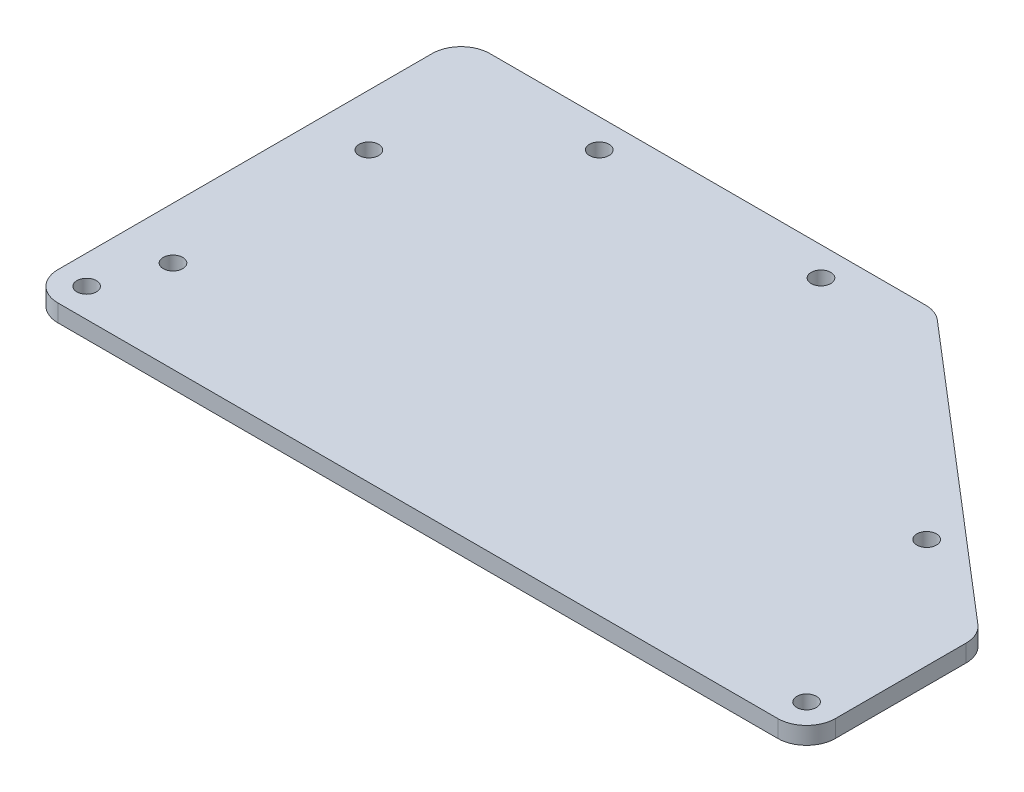
ISO-10303-21;
HEADER;
FILE_DESCRIPTION(('STEP AP214'),'2;1');
FILE_NAME('part.step','',(''),(''),'','','');
FILE_SCHEMA(('AUTOMOTIVE_DESIGN { 1 0 10303 214 1 1 1 1 }'));
ENDSEC;
DATA;
#1=APPLICATION_CONTEXT('core data for automotive mechanical design processes');
#2=APPLICATION_PROTOCOL_DEFINITION('international standard','automotive_design',2000,#1);
#3=PRODUCT_CONTEXT('',#1,'mechanical');
#4=PRODUCT('Part','Part','',(#3));
#5=PRODUCT_RELATED_PRODUCT_CATEGORY('part','',(#4));
#6=PRODUCT_DEFINITION_FORMATION('','',#4);
#7=PRODUCT_DEFINITION_CONTEXT('part definition',#1,'design');
#8=PRODUCT_DEFINITION('design','',#6,#7);
#9=PRODUCT_DEFINITION_SHAPE('','',#8);
#10=(LENGTH_UNIT() NAMED_UNIT(*) SI_UNIT(.MILLI.,.METRE.));
#11=(NAMED_UNIT(*) PLANE_ANGLE_UNIT() SI_UNIT($,.RADIAN.));
#12=(NAMED_UNIT(*) SI_UNIT($,.STERADIAN.) SOLID_ANGLE_UNIT());
#13=UNCERTAINTY_MEASURE_WITH_UNIT(LENGTH_MEASURE(1.E-05),#10,'distance_accuracy_value','');
#14=(GEOMETRIC_REPRESENTATION_CONTEXT(3) GLOBAL_UNCERTAINTY_ASSIGNED_CONTEXT((#13)) GLOBAL_UNIT_ASSIGNED_CONTEXT((#10,
#11,#12)) REPRESENTATION_CONTEXT('',''));
#15=CARTESIAN_POINT('',(0.,0.,0.));
#16=DIRECTION('',(0.,0.,1.));
#17=DIRECTION('',(1.,0.,0.));
#18=AXIS2_PLACEMENT_3D('',#15,#16,#17);
#19=CARTESIAN_POINT('',(67.5,3.,0.));
#20=DIRECTION('',(-1.,0.,0.));
#21=DIRECTION('',(0.,0.,1.));
#22=AXIS2_PLACEMENT_3D('',#19,#20,#21);
#23=PLANE('',#22);
#24=DIRECTION('',(0.,0.,-1.));
#25=VECTOR('',#24,1.);
#26=CARTESIAN_POINT('',(67.5,0.,0.));
#27=LINE('',#26,#25);
#28=CARTESIAN_POINT('',(67.5,0.,-5.));
#29=VERTEX_POINT('',#28);
#30=CARTESIAN_POINT('',(67.5,0.,-27.7003253876479));
#31=VERTEX_POINT('',#30);
#32=EDGE_CURVE('E211',#29,#31,#27,.T.);
#33=ORIENTED_EDGE('',*,*,#32,.T.);
#34=DIRECTION('',(0.,-1.,0.));
#35=VECTOR('',#34,1.);
#36=CARTESIAN_POINT('',(67.5,3.,-27.7003253876479));
#37=LINE('',#36,#35);
#38=CARTESIAN_POINT('',(67.5,3.,-27.7003253876479));
#39=VERTEX_POINT('',#38);
#40=EDGE_CURVE('E11',#31,#39,#37,.F.);
#41=ORIENTED_EDGE('',*,*,#40,.T.);
#42=DIRECTION('',(0.,0.,-1.));
#43=VECTOR('',#42,1.);
#44=CARTESIAN_POINT('',(67.5,3.,0.));
#45=LINE('',#44,#43);
#46=CARTESIAN_POINT('',(67.5,3.,-5.));
#47=VERTEX_POINT('',#46);
#48=EDGE_CURVE('E153',#47,#39,#45,.T.);
#49=ORIENTED_EDGE('',*,*,#48,.F.);
#50=DIRECTION('',(0.,-1.,0.));
#51=VECTOR('',#50,1.);
#52=CARTESIAN_POINT('',(67.5,3.,-5.));
#53=LINE('',#52,#51);
#54=EDGE_CURVE('E49',#47,#29,#53,.T.);
#55=ORIENTED_EDGE('',*,*,#54,.T.);
#56=EDGE_LOOP('',(#33,#41,#49,#55));
#57=FACE_BOUND('',#56,.T.);
#58=ADVANCED_FACE('F39',(#57),#23,.F.);
#59=CARTESIAN_POINT('',(67.5,3.,-30.));
#60=DIRECTION('',(-0.650791373455968,0.,0.759256602365297));
#61=DIRECTION('',(0.759256602365297,0.,0.650791373455968));
#62=AXIS2_PLACEMENT_3D('',#59,#60,#61);
#63=PLANE('',#62);
#64=DIRECTION('',(-0.759256602365297,0.,-0.650791373455968));
#65=VECTOR('',#64,1.);
#66=CARTESIAN_POINT('',(67.5,0.,-30.));
#67=LINE('',#66,#65);
#68=CARTESIAN_POINT('',(65.7539568672799,0.,-31.4966083994744));
#69=VERTEX_POINT('',#68);
#70=CARTESIAN_POINT('',(16.4043364862024,0.,-73.7962830118264));
#71=VERTEX_POINT('',#70);
#72=EDGE_CURVE('E155',#69,#71,#67,.T.);
#73=ORIENTED_EDGE('',*,*,#72,.T.);
#74=DIRECTION('',(0.,-1.,0.));
#75=VECTOR('',#74,1.);
#76=CARTESIAN_POINT('',(16.4043364862024,3.,-73.7962830118265));
#77=LINE('',#76,#75);
#78=CARTESIAN_POINT('',(16.4043364862024,3.,-73.7962830118264));
#79=VERTEX_POINT('',#78);
#80=EDGE_CURVE('E201',#71,#79,#77,.F.);
#81=ORIENTED_EDGE('',*,*,#80,.T.);
#82=DIRECTION('',(-0.759256602365297,0.,-0.650791373455968));
#83=VECTOR('',#82,1.);
#84=CARTESIAN_POINT('',(67.5,3.,-30.));
#85=LINE('',#84,#83);
#86=CARTESIAN_POINT('',(65.7539568672799,3.,-31.4966083994744));
#87=VERTEX_POINT('',#86);
#88=EDGE_CURVE('E266',#87,#79,#85,.T.);
#89=ORIENTED_EDGE('',*,*,#88,.F.);
#90=DIRECTION('',(0.,-1.,0.));
#91=VECTOR('',#90,1.);
#92=CARTESIAN_POINT('',(65.7539568672799,3.,-31.4966083994744));
#93=LINE('',#92,#91);
#94=EDGE_CURVE('E197',#87,#69,#93,.T.);
#95=ORIENTED_EDGE('',*,*,#94,.T.);
#96=EDGE_LOOP('',(#73,#81,#89,#95));
#97=FACE_BOUND('',#96,.T.);
#98=ADVANCED_FACE('F285',(#97),#63,.F.);
#99=CARTESIAN_POINT('',(-67.5,3.,-75.));
#100=DIRECTION('',(0.,0.,1.));
#101=DIRECTION('',(1.,0.,0.));
#102=AXIS2_PLACEMENT_3D('',#99,#100,#101);
#103=PLANE('',#102);
#104=DIRECTION('',(-1.,0.,0.));
#105=VECTOR('',#104,1.);
#106=CARTESIAN_POINT('',(-67.5,0.,-75.));
#107=LINE('',#106,#105);
#108=CARTESIAN_POINT('',(13.1503796189226,0.,-75.));
#109=VERTEX_POINT('',#108);
#110=CARTESIAN_POINT('',(-62.5,0.,-75.));
#111=VERTEX_POINT('',#110);
#112=EDGE_CURVE('E149',#109,#111,#107,.T.);
#113=ORIENTED_EDGE('',*,*,#112,.T.);
#114=DIRECTION('',(0.,-1.,0.));
#115=VECTOR('',#114,1.);
#116=CARTESIAN_POINT('',(-62.5,3.,-75.));
#117=LINE('',#116,#115);
#118=CARTESIAN_POINT('',(-62.5,3.,-75.));
#119=VERTEX_POINT('',#118);
#120=EDGE_CURVE('E125',#111,#119,#117,.F.);
#121=ORIENTED_EDGE('',*,*,#120,.T.);
#122=DIRECTION('',(-1.,0.,0.));
#123=VECTOR('',#122,1.);
#124=CARTESIAN_POINT('',(15.,3.,-75.));
#125=LINE('',#124,#123);
#126=CARTESIAN_POINT('',(13.1503796189226,3.,-75.));
#127=VERTEX_POINT('',#126);
#128=EDGE_CURVE('E270',#127,#119,#125,.T.);
#129=ORIENTED_EDGE('',*,*,#128,.F.);
#130=DIRECTION('',(0.,-1.,0.));
#131=VECTOR('',#130,1.);
#132=CARTESIAN_POINT('',(13.1503796189226,3.,-75.));
#133=LINE('',#132,#131);
#134=EDGE_CURVE('E131',#127,#109,#133,.T.);
#135=ORIENTED_EDGE('',*,*,#134,.T.);
#136=EDGE_LOOP('',(#113,#121,#129,#135));
#137=FACE_BOUND('',#136,.T.);
#138=ADVANCED_FACE('F295',(#137),#103,.F.);
#139=CARTESIAN_POINT('',(-67.5,3.,0.));
#140=DIRECTION('',(1.,0.,0.));
#141=DIRECTION('',(0.,0.,-1.));
#142=AXIS2_PLACEMENT_3D('',#139,#140,#141);
#143=PLANE('',#142);
#144=DIRECTION('',(0.,0.,1.));
#145=VECTOR('',#144,1.);
#146=CARTESIAN_POINT('',(-67.5,3.,-30.));
#147=LINE('',#146,#145);
#148=CARTESIAN_POINT('',(-67.5,3.,-70.));
#149=VERTEX_POINT('',#148);
#150=CARTESIAN_POINT('',(-67.5,3.,-5.00000000000001));
#151=VERTEX_POINT('',#150);
#152=EDGE_CURVE('E140',#149,#151,#147,.T.);
#153=ORIENTED_EDGE('',*,*,#152,.F.);
#154=DIRECTION('',(0.,-1.,0.));
#155=VECTOR('',#154,1.);
#156=CARTESIAN_POINT('',(-67.5,3.,-70.));
#157=LINE('',#156,#155);
#158=CARTESIAN_POINT('',(-67.5,0.,-70.));
#159=VERTEX_POINT('',#158);
#160=EDGE_CURVE('E124',#149,#159,#157,.T.);
#161=ORIENTED_EDGE('',*,*,#160,.T.);
#162=DIRECTION('',(0.,0.,1.));
#163=VECTOR('',#162,1.);
#164=CARTESIAN_POINT('',(-67.5,0.,0.));
#165=LINE('',#164,#163);
#166=CARTESIAN_POINT('',(-67.5,0.,-5.));
#167=VERTEX_POINT('',#166);
#168=EDGE_CURVE('E138',#159,#167,#165,.T.);
#169=ORIENTED_EDGE('',*,*,#168,.T.);
#170=DIRECTION('',(0.,-1.,0.));
#171=VECTOR('',#170,1.);
#172=CARTESIAN_POINT('',(-67.5,3.,-5.));
#173=LINE('',#172,#171);
#174=EDGE_CURVE('E143',#167,#151,#173,.F.);
#175=ORIENTED_EDGE('',*,*,#174,.T.);
#176=EDGE_LOOP('',(#153,#161,#169,#175));
#177=FACE_BOUND('',#176,.T.);
#178=ADVANCED_FACE('F137',(#177),#143,.F.);
#179=CARTESIAN_POINT('',(-67.5,3.,0.));
#180=DIRECTION('',(0.,0.,-1.));
#181=DIRECTION('',(-1.,0.,0.));
#182=AXIS2_PLACEMENT_3D('',#179,#180,#181);
#183=PLANE('',#182);
#184=DIRECTION('',(1.,0.,0.));
#185=VECTOR('',#184,1.);
#186=CARTESIAN_POINT('',(-67.5,3.,0.));
#187=LINE('',#186,#185);
#188=CARTESIAN_POINT('',(-62.5,3.,0.));
#189=VERTEX_POINT('',#188);
#190=CARTESIAN_POINT('',(62.5,3.,0.));
#191=VERTEX_POINT('',#190);
#192=EDGE_CURVE('E160',#189,#191,#187,.T.);
#193=ORIENTED_EDGE('',*,*,#192,.F.);
#194=DIRECTION('',(0.,-1.,0.));
#195=VECTOR('',#194,1.);
#196=CARTESIAN_POINT('',(-62.5,3.,0.));
#197=LINE('',#196,#195);
#198=CARTESIAN_POINT('',(-62.5,0.,0.));
#199=VERTEX_POINT('',#198);
#200=EDGE_CURVE('E193',#189,#199,#197,.T.);
#201=ORIENTED_EDGE('',*,*,#200,.T.);
#202=DIRECTION('',(1.,0.,0.));
#203=VECTOR('',#202,1.);
#204=CARTESIAN_POINT('',(-67.5,0.,0.));
#205=LINE('',#204,#203);
#206=CARTESIAN_POINT('',(62.5,0.,0.));
#207=VERTEX_POINT('',#206);
#208=EDGE_CURVE('E148',#199,#207,#205,.T.);
#209=ORIENTED_EDGE('',*,*,#208,.T.);
#210=DIRECTION('',(0.,-1.,0.));
#211=VECTOR('',#210,1.);
#212=CARTESIAN_POINT('',(62.5,3.,0.));
#213=LINE('',#212,#211);
#214=EDGE_CURVE('E57',#207,#191,#213,.F.);
#215=ORIENTED_EDGE('',*,*,#214,.T.);
#216=EDGE_LOOP('',(#193,#201,#209,#215));
#217=FACE_BOUND('',#216,.T.);
#218=ADVANCED_FACE('F302',(#217),#183,.F.);
#219=CARTESIAN_POINT('',(0.,3.,0.));
#220=DIRECTION('',(0.,1.,0.));
#221=DIRECTION('',(0.,0.,1.));
#222=AXIS2_PLACEMENT_3D('',#219,#220,#221);
#223=PLANE('',#222);
#224=CARTESIAN_POINT('',(-62.5,3.,-5.));
#225=DIRECTION('',(0.,1.,0.));
#226=DIRECTION('',(0.,0.,1.));
#227=AXIS2_PLACEMENT_3D('',#224,#225,#226);
#228=CIRCLE('',#227,1.69999999999999);
#229=CARTESIAN_POINT('',(-62.5,3.,-3.30000000000001));
#230=VERTEX_POINT('',#229);
#231=EDGE_CURVE('E244',#230,#230,#228,.T.);
#232=ORIENTED_EDGE('',*,*,#231,.F.);
#233=EDGE_LOOP('',(#232));
#234=FACE_BOUND('',#233,.T.);
#235=CARTESIAN_POINT('',(62.5,3.,-5.));
#236=DIRECTION('',(0.,1.,0.));
#237=DIRECTION('',(0.,0.,1.));
#238=AXIS2_PLACEMENT_3D('',#235,#236,#237);
#239=CIRCLE('',#238,1.69999999999999);
#240=CARTESIAN_POINT('',(62.5,3.,-3.30000000000001));
#241=VERTEX_POINT('',#240);
#242=EDGE_CURVE('E231',#241,#241,#239,.T.);
#243=ORIENTED_EDGE('',*,*,#242,.F.);
#244=EDGE_LOOP('',(#243));
#245=FACE_BOUND('',#244,.T.);
#246=CARTESIAN_POINT('',(0.,3.,-70.));
#247=DIRECTION('',(0.,1.,0.));
#248=DIRECTION('',(0.,0.,1.));
#249=AXIS2_PLACEMENT_3D('',#246,#247,#248);
#250=CIRCLE('',#249,1.69999999999999);
#251=CARTESIAN_POINT('',(0.,3.,-68.3));
#252=VERTEX_POINT('',#251);
#253=EDGE_CURVE('E227',#252,#252,#250,.T.);
#254=ORIENTED_EDGE('',*,*,#253,.F.);
#255=EDGE_LOOP('',(#254));
#256=FACE_BOUND('',#255,.T.);
#257=CARTESIAN_POINT('',(-58.5,3.,-15.99));
#258=DIRECTION('',(0.,1.,0.));
#259=DIRECTION('',(0.,0.,1.));
#260=AXIS2_PLACEMENT_3D('',#257,#258,#259);
#261=CIRCLE('',#260,1.69999999999999);
#262=CARTESIAN_POINT('',(-58.5,3.,-14.29));
#263=VERTEX_POINT('',#262);
#264=EDGE_CURVE('E223',#263,#263,#261,.T.);
#265=ORIENTED_EDGE('',*,*,#264,.F.);
#266=EDGE_LOOP('',(#265));
#267=FACE_BOUND('',#266,.T.);
#268=CARTESIAN_POINT('',(-58.5,3.,-50.));
#269=DIRECTION('',(0.,1.,0.));
#270=DIRECTION('',(0.,0.,1.));
#271=AXIS2_PLACEMENT_3D('',#268,#269,#270);
#272=CIRCLE('',#271,1.69999999999999);
#273=CARTESIAN_POINT('',(-58.5,3.,-48.3));
#274=VERTEX_POINT('',#273);
#275=EDGE_CURVE('E218',#274,#274,#272,.T.);
#276=ORIENTED_EDGE('',*,*,#275,.F.);
#277=EDGE_LOOP('',(#276));
#278=FACE_BOUND('',#277,.T.);
#279=CARTESIAN_POINT('',(-38.5,3.,-70.));
#280=DIRECTION('',(0.,1.,0.));
#281=DIRECTION('',(0.,0.,1.));
#282=AXIS2_PLACEMENT_3D('',#279,#280,#281);
#283=CIRCLE('',#282,1.69999999999999);
#284=CARTESIAN_POINT('',(-38.5,3.,-68.3));
#285=VERTEX_POINT('',#284);
#286=EDGE_CURVE('E217',#285,#285,#283,.T.);
#287=ORIENTED_EDGE('',*,*,#286,.F.);
#288=EDGE_LOOP('',(#287));
#289=FACE_BOUND('',#288,.T.);
#290=CARTESIAN_POINT('',(48.5,3.,-39.85));
#291=DIRECTION('',(0.,1.,0.));
#292=DIRECTION('',(0.,0.,1.));
#293=AXIS2_PLACEMENT_3D('',#290,#291,#292);
#294=CIRCLE('',#293,1.69999999999999);
#295=CARTESIAN_POINT('',(48.5,3.,-38.15));
#296=VERTEX_POINT('',#295);
#297=EDGE_CURVE('E212',#296,#296,#294,.T.);
#298=ORIENTED_EDGE('',*,*,#297,.F.);
#299=EDGE_LOOP('',(#298));
#300=FACE_BOUND('',#299,.T.);
#301=ORIENTED_EDGE('',*,*,#128,.T.);
#302=CARTESIAN_POINT('',(-62.5,3.,-70.));
#303=DIRECTION('',(0.,1.,0.));
#304=DIRECTION('',(0.,0.,1.));
#305=AXIS2_PLACEMENT_3D('',#302,#303,#304);
#306=CIRCLE('',#305,5.);
#307=EDGE_CURVE('E188',#119,#149,#306,.T.);
#308=ORIENTED_EDGE('',*,*,#307,.T.);
#309=ORIENTED_EDGE('',*,*,#152,.T.);
#310=CARTESIAN_POINT('',(-62.5,3.,-5.));
#311=DIRECTION('',(0.,1.,0.));
#312=DIRECTION('',(0.,0.,1.));
#313=AXIS2_PLACEMENT_3D('',#310,#311,#312);
#314=CIRCLE('',#313,5.);
#315=EDGE_CURVE('E64',#151,#189,#314,.T.);
#316=ORIENTED_EDGE('',*,*,#315,.T.);
#317=ORIENTED_EDGE('',*,*,#192,.T.);
#318=CARTESIAN_POINT('',(62.5,3.,-5.));
#319=DIRECTION('',(0.,1.,0.));
#320=DIRECTION('',(0.,0.,1.));
#321=AXIS2_PLACEMENT_3D('',#318,#319,#320);
#322=CIRCLE('',#321,5.);
#323=EDGE_CURVE('E177',#191,#47,#322,.T.);
#324=ORIENTED_EDGE('',*,*,#323,.T.);
#325=ORIENTED_EDGE('',*,*,#48,.T.);
#326=CARTESIAN_POINT('',(62.5,3.,-27.7003253876479));
#327=DIRECTION('',(0.,1.,0.));
#328=DIRECTION('',(0.,0.,1.));
#329=AXIS2_PLACEMENT_3D('',#326,#327,#328);
#330=CIRCLE('',#329,5.);
#331=EDGE_CURVE('E180',#39,#87,#330,.T.);
#332=ORIENTED_EDGE('',*,*,#331,.T.);
#333=ORIENTED_EDGE('',*,*,#88,.T.);
#334=CARTESIAN_POINT('',(13.1503796189226,3.,-70.));
#335=DIRECTION('',(0.,1.,0.));
#336=DIRECTION('',(0.,0.,1.));
#337=AXIS2_PLACEMENT_3D('',#334,#335,#336);
#338=CIRCLE('',#337,5.);
#339=EDGE_CURVE('E183',#79,#127,#338,.T.);
#340=ORIENTED_EDGE('',*,*,#339,.T.);
#341=EDGE_LOOP('',(#301,#308,#309,#316,#317,#324,#325,#332,#333,#340));
#342=FACE_BOUND('',#341,.T.);
#343=ADVANCED_FACE('F293',(#234,#245,#256,#267,#278,#289,#300,#342),#223,.T.);
#344=CARTESIAN_POINT('',(0.,0.,0.));
#345=DIRECTION('',(0.,1.,0.));
#346=DIRECTION('',(0.,0.,1.));
#347=AXIS2_PLACEMENT_3D('',#344,#345,#346);
#348=PLANE('',#347);
#349=CARTESIAN_POINT('',(-62.5,0.,-5.));
#350=DIRECTION('',(0.,1.,0.));
#351=DIRECTION('',(0.,0.,1.));
#352=AXIS2_PLACEMENT_3D('',#349,#350,#351);
#353=CIRCLE('',#352,1.69999999999999);
#354=CARTESIAN_POINT('',(-62.5,0.,-3.30000000000001));
#355=VERTEX_POINT('',#354);
#356=EDGE_CURVE('E43',#355,#355,#353,.T.);
#357=ORIENTED_EDGE('',*,*,#356,.T.);
#358=EDGE_LOOP('',(#357));
#359=FACE_BOUND('',#358,.T.);
#360=CARTESIAN_POINT('',(62.5,0.,-5.));
#361=DIRECTION('',(0.,1.,0.));
#362=DIRECTION('',(0.,0.,1.));
#363=AXIS2_PLACEMENT_3D('',#360,#361,#362);
#364=CIRCLE('',#363,1.69999999999999);
#365=CARTESIAN_POINT('',(62.5,0.,-3.30000000000001));
#366=VERTEX_POINT('',#365);
#367=EDGE_CURVE('E228',#366,#366,#364,.T.);
#368=ORIENTED_EDGE('',*,*,#367,.T.);
#369=EDGE_LOOP('',(#368));
#370=FACE_BOUND('',#369,.T.);
#371=CARTESIAN_POINT('',(0.,0.,-70.));
#372=DIRECTION('',(0.,1.,0.));
#373=DIRECTION('',(0.,0.,1.));
#374=AXIS2_PLACEMENT_3D('',#371,#372,#373);
#375=CIRCLE('',#374,1.69999999999999);
#376=CARTESIAN_POINT('',(0.,0.,-68.3));
#377=VERTEX_POINT('',#376);
#378=EDGE_CURVE('E224',#377,#377,#375,.T.);
#379=ORIENTED_EDGE('',*,*,#378,.T.);
#380=EDGE_LOOP('',(#379));
#381=FACE_BOUND('',#380,.T.);
#382=CARTESIAN_POINT('',(-58.5,0.,-15.99));
#383=DIRECTION('',(0.,1.,0.));
#384=DIRECTION('',(0.,0.,1.));
#385=AXIS2_PLACEMENT_3D('',#382,#383,#384);
#386=CIRCLE('',#385,1.69999999999999);
#387=CARTESIAN_POINT('',(-58.5,0.,-14.29));
#388=VERTEX_POINT('',#387);
#389=EDGE_CURVE('E219',#388,#388,#386,.T.);
#390=ORIENTED_EDGE('',*,*,#389,.T.);
#391=EDGE_LOOP('',(#390));
#392=FACE_BOUND('',#391,.T.);
#393=CARTESIAN_POINT('',(-58.5,0.,-50.));
#394=DIRECTION('',(0.,1.,0.));
#395=DIRECTION('',(0.,0.,1.));
#396=AXIS2_PLACEMENT_3D('',#393,#394,#395);
#397=CIRCLE('',#396,1.69999999999999);
#398=CARTESIAN_POINT('',(-58.5,0.,-48.3));
#399=VERTEX_POINT('',#398);
#400=EDGE_CURVE('E213',#399,#399,#397,.T.);
#401=ORIENTED_EDGE('',*,*,#400,.T.);
#402=EDGE_LOOP('',(#401));
#403=FACE_BOUND('',#402,.T.);
#404=CARTESIAN_POINT('',(-38.5,0.,-70.));
#405=DIRECTION('',(0.,1.,0.));
#406=DIRECTION('',(0.,0.,1.));
#407=AXIS2_PLACEMENT_3D('',#404,#405,#406);
#408=CIRCLE('',#407,1.69999999999999);
#409=CARTESIAN_POINT('',(-38.5,0.,-68.3));
#410=VERTEX_POINT('',#409);
#411=EDGE_CURVE('E256',#410,#410,#408,.T.);
#412=ORIENTED_EDGE('',*,*,#411,.T.);
#413=EDGE_LOOP('',(#412));
#414=FACE_BOUND('',#413,.T.);
#415=CARTESIAN_POINT('',(48.5,0.,-39.85));
#416=DIRECTION('',(0.,1.,0.));
#417=DIRECTION('',(0.,0.,1.));
#418=AXIS2_PLACEMENT_3D('',#415,#416,#417);
#419=CIRCLE('',#418,1.69999999999999);
#420=CARTESIAN_POINT('',(48.5,0.,-38.15));
#421=VERTEX_POINT('',#420);
#422=EDGE_CURVE('E207',#421,#421,#419,.T.);
#423=ORIENTED_EDGE('',*,*,#422,.T.);
#424=EDGE_LOOP('',(#423));
#425=FACE_BOUND('',#424,.T.);
#426=ORIENTED_EDGE('',*,*,#168,.F.);
#427=CARTESIAN_POINT('',(-62.5,0.,-70.));
#428=DIRECTION('',(0.,1.,0.));
#429=DIRECTION('',(0.,0.,1.));
#430=AXIS2_PLACEMENT_3D('',#427,#428,#429);
#431=CIRCLE('',#430,5.);
#432=EDGE_CURVE('E120',#159,#111,#431,.F.);
#433=ORIENTED_EDGE('',*,*,#432,.T.);
#434=ORIENTED_EDGE('',*,*,#112,.F.);
#435=CARTESIAN_POINT('',(13.1503796189226,0.,-70.));
#436=DIRECTION('',(0.,1.,0.));
#437=DIRECTION('',(0.,0.,1.));
#438=AXIS2_PLACEMENT_3D('',#435,#436,#437);
#439=CIRCLE('',#438,5.);
#440=EDGE_CURVE('E167',#109,#71,#439,.F.);
#441=ORIENTED_EDGE('',*,*,#440,.T.);
#442=ORIENTED_EDGE('',*,*,#72,.F.);
#443=CARTESIAN_POINT('',(62.5,0.,-27.7003253876479));
#444=DIRECTION('',(0.,1.,0.));
#445=DIRECTION('',(0.,0.,1.));
#446=AXIS2_PLACEMENT_3D('',#443,#444,#445);
#447=CIRCLE('',#446,5.);
#448=EDGE_CURVE('E164',#69,#31,#447,.F.);
#449=ORIENTED_EDGE('',*,*,#448,.T.);
#450=ORIENTED_EDGE('',*,*,#32,.F.);
#451=CARTESIAN_POINT('',(62.5,0.,-5.));
#452=DIRECTION('',(0.,1.,0.));
#453=DIRECTION('',(0.,0.,1.));
#454=AXIS2_PLACEMENT_3D('',#451,#452,#453);
#455=CIRCLE('',#454,5.);
#456=EDGE_CURVE('E142',#29,#207,#455,.F.);
#457=ORIENTED_EDGE('',*,*,#456,.T.);
#458=ORIENTED_EDGE('',*,*,#208,.F.);
#459=CARTESIAN_POINT('',(-62.5,0.,-5.));
#460=DIRECTION('',(0.,1.,0.));
#461=DIRECTION('',(0.,0.,1.));
#462=AXIS2_PLACEMENT_3D('',#459,#460,#461);
#463=CIRCLE('',#462,5.);
#464=EDGE_CURVE('E132',#199,#167,#463,.F.);
#465=ORIENTED_EDGE('',*,*,#464,.T.);
#466=EDGE_LOOP('',(#426,#433,#434,#441,#442,#449,#450,#457,#458,#465));
#467=FACE_BOUND('',#466,.T.);
#468=ADVANCED_FACE('F145',(#359,#370,#381,#392,#403,#414,#425,#467),#348,.F.);
#469=CARTESIAN_POINT('',(-62.5,3.,-70.));
#470=DIRECTION('',(0.,-1.,0.));
#471=DIRECTION('',(0.,0.,-1.));
#472=AXIS2_PLACEMENT_3D('',#469,#470,#471);
#473=CYLINDRICAL_SURFACE('',#472,5.);
#474=ORIENTED_EDGE('',*,*,#307,.F.);
#475=ORIENTED_EDGE('',*,*,#120,.F.);
#476=ORIENTED_EDGE('',*,*,#432,.F.);
#477=ORIENTED_EDGE('',*,*,#160,.F.);
#478=EDGE_LOOP('',(#474,#475,#476,#477));
#479=FACE_BOUND('',#478,.T.);
#480=ADVANCED_FACE('F123',(#479),#473,.T.);
#481=CARTESIAN_POINT('',(-62.5,3.,-5.));
#482=DIRECTION('',(0.,-1.,0.));
#483=DIRECTION('',(0.,0.,-1.));
#484=AXIS2_PLACEMENT_3D('',#481,#482,#483);
#485=CYLINDRICAL_SURFACE('',#484,5.);
#486=ORIENTED_EDGE('',*,*,#315,.F.);
#487=ORIENTED_EDGE('',*,*,#174,.F.);
#488=ORIENTED_EDGE('',*,*,#464,.F.);
#489=ORIENTED_EDGE('',*,*,#200,.F.);
#490=EDGE_LOOP('',(#486,#487,#488,#489));
#491=FACE_BOUND('',#490,.T.);
#492=ADVANCED_FACE('F313',(#491),#485,.T.);
#493=CARTESIAN_POINT('',(13.1503796189226,3.,-70.));
#494=DIRECTION('',(0.,-1.,0.));
#495=DIRECTION('',(0.,0.,-1.));
#496=AXIS2_PLACEMENT_3D('',#493,#494,#495);
#497=CYLINDRICAL_SURFACE('',#496,5.);
#498=ORIENTED_EDGE('',*,*,#339,.F.);
#499=ORIENTED_EDGE('',*,*,#80,.F.);
#500=ORIENTED_EDGE('',*,*,#440,.F.);
#501=ORIENTED_EDGE('',*,*,#134,.F.);
#502=EDGE_LOOP('',(#498,#499,#500,#501));
#503=FACE_BOUND('',#502,.T.);
#504=ADVANCED_FACE('F290',(#503),#497,.T.);
#505=CARTESIAN_POINT('',(62.5,3.,-27.7003253876479));
#506=DIRECTION('',(0.,-1.,0.));
#507=DIRECTION('',(0.,0.,-1.));
#508=AXIS2_PLACEMENT_3D('',#505,#506,#507);
#509=CYLINDRICAL_SURFACE('',#508,5.);
#510=ORIENTED_EDGE('',*,*,#331,.F.);
#511=ORIENTED_EDGE('',*,*,#40,.F.);
#512=ORIENTED_EDGE('',*,*,#448,.F.);
#513=ORIENTED_EDGE('',*,*,#94,.F.);
#514=EDGE_LOOP('',(#510,#511,#512,#513));
#515=FACE_BOUND('',#514,.T.);
#516=ADVANCED_FACE('F318',(#515),#509,.T.);
#517=CARTESIAN_POINT('',(62.5,3.,-5.));
#518=DIRECTION('',(0.,-1.,0.));
#519=DIRECTION('',(0.,0.,-1.));
#520=AXIS2_PLACEMENT_3D('',#517,#518,#519);
#521=CYLINDRICAL_SURFACE('',#520,5.);
#522=ORIENTED_EDGE('',*,*,#323,.F.);
#523=ORIENTED_EDGE('',*,*,#214,.F.);
#524=ORIENTED_EDGE('',*,*,#456,.F.);
#525=ORIENTED_EDGE('',*,*,#54,.F.);
#526=EDGE_LOOP('',(#522,#523,#524,#525));
#527=FACE_BOUND('',#526,.T.);
#528=ADVANCED_FACE('F41',(#527),#521,.T.);
#529=CARTESIAN_POINT('',(48.5,3.,-39.85));
#530=DIRECTION('',(0.,1.,0.));
#531=DIRECTION('',(0.,0.,1.));
#532=AXIS2_PLACEMENT_3D('',#529,#530,#531);
#533=CYLINDRICAL_SURFACE('',#532,1.69999999999999);
#534=ORIENTED_EDGE('',*,*,#297,.T.);
#535=EDGE_LOOP('',(#534));
#536=FACE_BOUND('',#535,.T.);
#537=ORIENTED_EDGE('',*,*,#422,.F.);
#538=EDGE_LOOP('',(#537));
#539=FACE_BOUND('',#538,.T.);
#540=ADVANCED_FACE('F324',(#536,#539),#533,.F.);
#541=CARTESIAN_POINT('',(-38.5,3.,-70.));
#542=DIRECTION('',(0.,1.,0.));
#543=DIRECTION('',(0.,0.,1.));
#544=AXIS2_PLACEMENT_3D('',#541,#542,#543);
#545=CYLINDRICAL_SURFACE('',#544,1.69999999999999);
#546=ORIENTED_EDGE('',*,*,#286,.T.);
#547=EDGE_LOOP('',(#546));
#548=FACE_BOUND('',#547,.T.);
#549=ORIENTED_EDGE('',*,*,#411,.F.);
#550=EDGE_LOOP('',(#549));
#551=FACE_BOUND('',#550,.T.);
#552=ADVANCED_FACE('F346',(#548,#551),#545,.F.);
#553=CARTESIAN_POINT('',(-58.5,3.,-50.));
#554=DIRECTION('',(0.,1.,0.));
#555=DIRECTION('',(0.,0.,1.));
#556=AXIS2_PLACEMENT_3D('',#553,#554,#555);
#557=CYLINDRICAL_SURFACE('',#556,1.69999999999999);
#558=ORIENTED_EDGE('',*,*,#275,.T.);
#559=EDGE_LOOP('',(#558));
#560=FACE_BOUND('',#559,.T.);
#561=ORIENTED_EDGE('',*,*,#400,.F.);
#562=EDGE_LOOP('',(#561));
#563=FACE_BOUND('',#562,.T.);
#564=ADVANCED_FACE('F350',(#560,#563),#557,.F.);
#565=CARTESIAN_POINT('',(-58.5,3.,-15.99));
#566=DIRECTION('',(0.,1.,0.));
#567=DIRECTION('',(0.,0.,1.));
#568=AXIS2_PLACEMENT_3D('',#565,#566,#567);
#569=CYLINDRICAL_SURFACE('',#568,1.69999999999999);
#570=ORIENTED_EDGE('',*,*,#264,.T.);
#571=EDGE_LOOP('',(#570));
#572=FACE_BOUND('',#571,.T.);
#573=ORIENTED_EDGE('',*,*,#389,.F.);
#574=EDGE_LOOP('',(#573));
#575=FACE_BOUND('',#574,.T.);
#576=ADVANCED_FACE('F354',(#572,#575),#569,.F.);
#577=CARTESIAN_POINT('',(0.,3.,-70.));
#578=DIRECTION('',(0.,1.,0.));
#579=DIRECTION('',(0.,0.,1.));
#580=AXIS2_PLACEMENT_3D('',#577,#578,#579);
#581=CYLINDRICAL_SURFACE('',#580,1.69999999999999);
#582=ORIENTED_EDGE('',*,*,#253,.T.);
#583=EDGE_LOOP('',(#582));
#584=FACE_BOUND('',#583,.T.);
#585=ORIENTED_EDGE('',*,*,#378,.F.);
#586=EDGE_LOOP('',(#585));
#587=FACE_BOUND('',#586,.T.);
#588=ADVANCED_FACE('F358',(#584,#587),#581,.F.);
#589=CARTESIAN_POINT('',(62.5,3.,-5.));
#590=DIRECTION('',(0.,1.,0.));
#591=DIRECTION('',(0.,0.,1.));
#592=AXIS2_PLACEMENT_3D('',#589,#590,#591);
#593=CYLINDRICAL_SURFACE('',#592,1.69999999999999);
#594=ORIENTED_EDGE('',*,*,#242,.T.);
#595=EDGE_LOOP('',(#594));
#596=FACE_BOUND('',#595,.T.);
#597=ORIENTED_EDGE('',*,*,#367,.F.);
#598=EDGE_LOOP('',(#597));
#599=FACE_BOUND('',#598,.T.);
#600=ADVANCED_FACE('F362',(#596,#599),#593,.F.);
#601=CARTESIAN_POINT('',(-62.5,3.,-5.));
#602=DIRECTION('',(0.,1.,0.));
#603=DIRECTION('',(0.,0.,1.));
#604=AXIS2_PLACEMENT_3D('',#601,#602,#603);
#605=CYLINDRICAL_SURFACE('',#604,1.69999999999999);
#606=ORIENTED_EDGE('',*,*,#231,.T.);
#607=EDGE_LOOP('',(#606));
#608=FACE_BOUND('',#607,.T.);
#609=ORIENTED_EDGE('',*,*,#356,.F.);
#610=EDGE_LOOP('',(#609));
#611=FACE_BOUND('',#610,.T.);
#612=ADVANCED_FACE('F366',(#608,#611),#605,.F.);
#613=CLOSED_SHELL('',(#58,#98,#138,#178,#218,#343,#468,#480,#492,#504,#516,#528,#540,#552,#564,
#576,#588,#600,#612));
#614=MANIFOLD_SOLID_BREP('B2',#613);
#615=ADVANCED_BREP_SHAPE_REPRESENTATION('',(#18,#614),#14);
#616=SHAPE_DEFINITION_REPRESENTATION(#9,#615);
ENDSEC;
END-ISO-10303-21;
